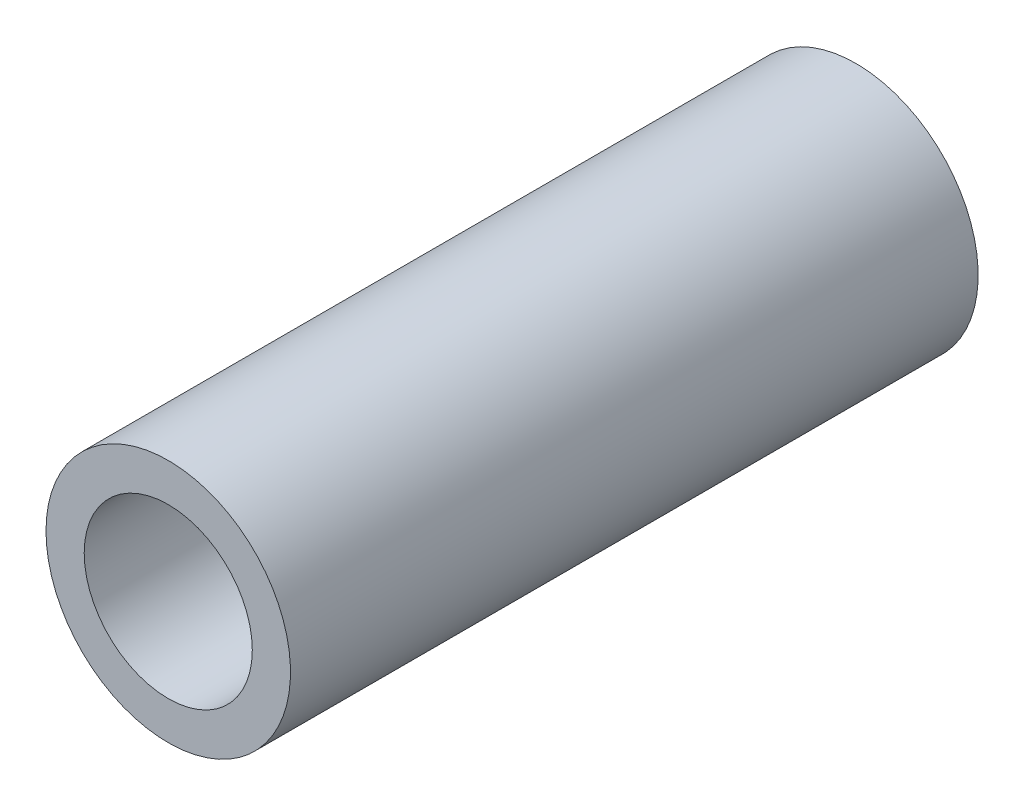
ISO-10303-21;
HEADER;
FILE_DESCRIPTION(('STEP AP214'),'2;1');
FILE_NAME('part.step','',(''),(''),'','','');
FILE_SCHEMA(('AUTOMOTIVE_DESIGN { 1 0 10303 214 1 1 1 1 }'));
ENDSEC;
DATA;
#1=APPLICATION_CONTEXT('core data for automotive mechanical design processes');
#2=APPLICATION_PROTOCOL_DEFINITION('international standard','automotive_design',2000,#1);
#3=PRODUCT_CONTEXT('',#1,'mechanical');
#4=PRODUCT('Part','Part','',(#3));
#5=PRODUCT_RELATED_PRODUCT_CATEGORY('part','',(#4));
#6=PRODUCT_DEFINITION_FORMATION('','',#4);
#7=PRODUCT_DEFINITION_CONTEXT('part definition',#1,'design');
#8=PRODUCT_DEFINITION('design','',#6,#7);
#9=PRODUCT_DEFINITION_SHAPE('','',#8);
#10=(LENGTH_UNIT() NAMED_UNIT(*) SI_UNIT(.MILLI.,.METRE.));
#11=(NAMED_UNIT(*) PLANE_ANGLE_UNIT() SI_UNIT($,.RADIAN.));
#12=(NAMED_UNIT(*) SI_UNIT($,.STERADIAN.) SOLID_ANGLE_UNIT());
#13=UNCERTAINTY_MEASURE_WITH_UNIT(LENGTH_MEASURE(1.E-05),#10,'distance_accuracy_value','');
#14=(GEOMETRIC_REPRESENTATION_CONTEXT(3) GLOBAL_UNCERTAINTY_ASSIGNED_CONTEXT((#13)) GLOBAL_UNIT_ASSIGNED_CONTEXT((#10,
#11,#12)) REPRESENTATION_CONTEXT('',''));
#15=CARTESIAN_POINT('',(0.,0.,0.));
#16=DIRECTION('',(0.,0.,1.));
#17=DIRECTION('',(1.,0.,0.));
#18=AXIS2_PLACEMENT_3D('',#15,#16,#17);
#19=CARTESIAN_POINT('',(0.,0.,11.25));
#20=DIRECTION('',(0.,0.,1.));
#21=DIRECTION('',(1.,0.,0.));
#22=AXIS2_PLACEMENT_3D('',#19,#20,#21);
#23=PLANE('',#22);
#24=CARTESIAN_POINT('',(0.,0.,11.25));
#25=DIRECTION('',(0.,0.,1.));
#26=DIRECTION('',(1.,0.,0.));
#27=AXIS2_PLACEMENT_3D('',#24,#25,#26);
#28=CIRCLE('',#27,2.);
#29=CARTESIAN_POINT('',(-2.,0.,11.25));
#30=VERTEX_POINT('',#29);
#31=EDGE_CURVE('E10',#30,#30,#28,.T.);
#32=ORIENTED_EDGE('',*,*,#31,.T.);
#33=EDGE_LOOP('',(#32));
#34=FACE_BOUND('',#33,.T.);
#35=CARTESIAN_POINT('',(0.,0.,11.25));
#36=DIRECTION('',(0.,0.,1.));
#37=DIRECTION('',(1.,0.,0.));
#38=AXIS2_PLACEMENT_3D('',#35,#36,#37);
#39=CIRCLE('',#38,1.375);
#40=CARTESIAN_POINT('',(-1.375,0.,11.25));
#41=VERTEX_POINT('',#40);
#42=EDGE_CURVE('E42',#41,#41,#39,.T.);
#43=ORIENTED_EDGE('',*,*,#42,.F.);
#44=EDGE_LOOP('',(#43));
#45=FACE_BOUND('',#44,.T.);
#46=ADVANCED_FACE('F31',(#34,#45),#23,.T.);
#47=CARTESIAN_POINT('',(0.,0.,0.));
#48=DIRECTION('',(0.,0.,1.));
#49=DIRECTION('',(1.,0.,0.));
#50=AXIS2_PLACEMENT_3D('',#47,#48,#49);
#51=PLANE('',#50);
#52=CARTESIAN_POINT('',(0.,0.,0.));
#53=DIRECTION('',(0.,0.,1.));
#54=DIRECTION('',(1.,0.,0.));
#55=AXIS2_PLACEMENT_3D('',#52,#53,#54);
#56=CIRCLE('',#55,2.);
#57=CARTESIAN_POINT('',(-2.,0.,0.));
#58=VERTEX_POINT('',#57);
#59=EDGE_CURVE('E35',#58,#58,#56,.T.);
#60=ORIENTED_EDGE('',*,*,#59,.F.);
#61=EDGE_LOOP('',(#60));
#62=FACE_BOUND('',#61,.T.);
#63=CARTESIAN_POINT('',(0.,0.,0.));
#64=DIRECTION('',(0.,0.,1.));
#65=DIRECTION('',(1.,0.,0.));
#66=AXIS2_PLACEMENT_3D('',#63,#64,#65);
#67=CIRCLE('',#66,1.375);
#68=CARTESIAN_POINT('',(-1.375,0.,0.));
#69=VERTEX_POINT('',#68);
#70=EDGE_CURVE('E44',#69,#69,#67,.T.);
#71=ORIENTED_EDGE('',*,*,#70,.T.);
#72=EDGE_LOOP('',(#71));
#73=FACE_BOUND('',#72,.T.);
#74=ADVANCED_FACE('F54',(#62,#73),#51,.F.);
#75=CARTESIAN_POINT('',(0.,0.,11.25));
#76=DIRECTION('',(0.,0.,-1.));
#77=DIRECTION('',(-1.,0.,0.));
#78=AXIS2_PLACEMENT_3D('',#75,#76,#77);
#79=CYLINDRICAL_SURFACE('',#78,2.);
#80=CARTESIAN_POINT('',(-2.,0.,11.25));
#81=CARTESIAN_POINT('',(-2.,0.,11.1328125));
#82=CARTESIAN_POINT('',(-2.,0.,11.015625));
#83=CARTESIAN_POINT('',(-2.,0.,10.78125));
#84=CARTESIAN_POINT('',(-2.,0.,10.6640625));
#85=CARTESIAN_POINT('',(-2.,0.,10.4296875));
#86=CARTESIAN_POINT('',(-2.,0.,10.3125));
#87=CARTESIAN_POINT('',(-2.,0.,10.078125));
#88=CARTESIAN_POINT('',(-2.,0.,9.9609375));
#89=CARTESIAN_POINT('',(-2.,0.,9.7265625));
#90=CARTESIAN_POINT('',(-2.,0.,9.609375));
#91=CARTESIAN_POINT('',(-2.,0.,9.375));
#92=CARTESIAN_POINT('',(-2.,0.,9.2578125));
#93=CARTESIAN_POINT('',(-2.,0.,9.0234375));
#94=CARTESIAN_POINT('',(-2.,0.,8.90625));
#95=CARTESIAN_POINT('',(-2.,0.,8.671875));
#96=CARTESIAN_POINT('',(-2.,0.,8.5546875));
#97=CARTESIAN_POINT('',(-2.,0.,8.3203125));
#98=CARTESIAN_POINT('',(-2.,0.,8.203125));
#99=CARTESIAN_POINT('',(-2.,0.,7.96875));
#100=CARTESIAN_POINT('',(-2.,0.,7.8515625));
#101=CARTESIAN_POINT('',(-2.,0.,7.6171875));
#102=CARTESIAN_POINT('',(-2.,0.,7.5));
#103=CARTESIAN_POINT('',(-2.,0.,7.265625));
#104=CARTESIAN_POINT('',(-2.,0.,7.1484375));
#105=CARTESIAN_POINT('',(-2.,0.,6.9140625));
#106=CARTESIAN_POINT('',(-2.,0.,6.796875));
#107=CARTESIAN_POINT('',(-2.,0.,6.5625));
#108=CARTESIAN_POINT('',(-2.,0.,6.4453125));
#109=CARTESIAN_POINT('',(-2.,0.,6.2109375));
#110=CARTESIAN_POINT('',(-2.,0.,6.09375));
#111=CARTESIAN_POINT('',(-2.,0.,5.859375));
#112=CARTESIAN_POINT('',(-2.,0.,5.7421875));
#113=CARTESIAN_POINT('',(-2.,0.,5.5078125));
#114=CARTESIAN_POINT('',(-2.,0.,5.390625));
#115=CARTESIAN_POINT('',(-2.,0.,5.15625));
#116=CARTESIAN_POINT('',(-2.,0.,5.0390625));
#117=CARTESIAN_POINT('',(-2.,0.,4.8046875));
#118=CARTESIAN_POINT('',(-2.,0.,4.6875));
#119=CARTESIAN_POINT('',(-2.,0.,4.453125));
#120=CARTESIAN_POINT('',(-2.,0.,4.3359375));
#121=CARTESIAN_POINT('',(-2.,0.,4.1015625));
#122=CARTESIAN_POINT('',(-2.,0.,3.984375));
#123=CARTESIAN_POINT('',(-2.,0.,3.75));
#124=CARTESIAN_POINT('',(-2.,0.,3.6328125));
#125=CARTESIAN_POINT('',(-2.,0.,3.3984375));
#126=CARTESIAN_POINT('',(-2.,0.,3.28125));
#127=CARTESIAN_POINT('',(-2.,0.,3.046875));
#128=CARTESIAN_POINT('',(-2.,0.,2.9296875));
#129=CARTESIAN_POINT('',(-2.,0.,2.6953125));
#130=CARTESIAN_POINT('',(-2.,0.,2.578125));
#131=CARTESIAN_POINT('',(-2.,0.,2.34375));
#132=CARTESIAN_POINT('',(-2.,0.,2.2265625));
#133=CARTESIAN_POINT('',(-2.,0.,1.9921875));
#134=CARTESIAN_POINT('',(-2.,0.,1.875));
#135=CARTESIAN_POINT('',(-2.,0.,1.640625));
#136=CARTESIAN_POINT('',(-2.,0.,1.5234375));
#137=CARTESIAN_POINT('',(-2.,0.,1.2890625));
#138=CARTESIAN_POINT('',(-2.,0.,1.171875));
#139=CARTESIAN_POINT('',(-2.,0.,0.937499999999999));
#140=CARTESIAN_POINT('',(-2.,0.,0.820312499999999));
#141=CARTESIAN_POINT('',(-2.,0.,0.585937499999998));
#142=CARTESIAN_POINT('',(-2.,0.,0.468749999999998));
#143=CARTESIAN_POINT('',(-2.,0.,0.234374999999998));
#144=CARTESIAN_POINT('',(-2.,0.,0.117187499999998));
#145=CARTESIAN_POINT('',(-2.,0.,0.));
#146=B_SPLINE_CURVE_WITH_KNOTS('',3,(#80,#81,#82,#83,#84,#85,#86,#87,#88,#89,#90,#91,#92,#93,
#94,#95,#96,#97,#98,#99,#100,#101,#102,#103,#104,#105,#106,#107,#108,#109,#110,#111,#112,#113,
#114,#115,#116,#117,#118,#119,#120,#121,#122,#123,#124,#125,#126,#127,#128,#129,#130,#131,#132,
#133,#134,#135,#136,#137,#138,#139,#140,#141,#142,#143,#144,#145),.UNSPECIFIED.,.F.,.F.,(4,2,2,
2,2,2,2,2,2,2,2,2,2,2,2,2,2,2,2,2,2,2,2,2,2,2,2,2,2,2,2,2,4),(0.,0.351562500000001,
0.703125000000001,1.0546875,1.40625,1.7578125,2.109375,2.4609375,2.8125,3.1640625,3.515625,
3.8671875,4.21875,4.5703125,4.921875,5.2734375,5.625,5.9765625,6.328125,6.6796875,7.03125,
7.3828125,7.734375,8.0859375,8.4375,8.7890625,9.140625,9.4921875,9.84375,10.1953125,10.546875,
10.8984375,11.25),.UNSPECIFIED.);
#147=EDGE_CURVE('BSEAM33',#30,#58,#146,.T.);
#148=ORIENTED_EDGE('',*,*,#31,.F.);
#149=ORIENTED_EDGE('',*,*,#59,.T.);
#150=ORIENTED_EDGE('',*,*,#147,.T.);
#151=ORIENTED_EDGE('',*,*,#147,.F.);
#152=EDGE_LOOP('',(#148,#150,#149,#151));
#153=FACE_BOUND('',#152,.T.);
#154=ADVANCED_FACE('F33',(#153),#79,.T.);
#155=CARTESIAN_POINT('',(0.,0.,11.25));
#156=DIRECTION('',(0.,0.,-1.));
#157=DIRECTION('',(-1.,0.,0.));
#158=AXIS2_PLACEMENT_3D('',#155,#156,#157);
#159=CYLINDRICAL_SURFACE('',#158,1.375);
#160=CARTESIAN_POINT('',(-1.375,0.,11.25));
#161=CARTESIAN_POINT('',(-1.375,0.,11.1328125));
#162=CARTESIAN_POINT('',(-1.375,0.,11.015625));
#163=CARTESIAN_POINT('',(-1.375,0.,10.78125));
#164=CARTESIAN_POINT('',(-1.375,0.,10.6640625));
#165=CARTESIAN_POINT('',(-1.375,0.,10.4296875));
#166=CARTESIAN_POINT('',(-1.375,0.,10.3125));
#167=CARTESIAN_POINT('',(-1.375,0.,10.078125));
#168=CARTESIAN_POINT('',(-1.375,0.,9.9609375));
#169=CARTESIAN_POINT('',(-1.375,0.,9.7265625));
#170=CARTESIAN_POINT('',(-1.375,0.,9.609375));
#171=CARTESIAN_POINT('',(-1.375,0.,9.375));
#172=CARTESIAN_POINT('',(-1.375,0.,9.2578125));
#173=CARTESIAN_POINT('',(-1.375,0.,9.0234375));
#174=CARTESIAN_POINT('',(-1.375,0.,8.90625));
#175=CARTESIAN_POINT('',(-1.375,0.,8.671875));
#176=CARTESIAN_POINT('',(-1.375,0.,8.5546875));
#177=CARTESIAN_POINT('',(-1.375,0.,8.3203125));
#178=CARTESIAN_POINT('',(-1.375,0.,8.203125));
#179=CARTESIAN_POINT('',(-1.375,0.,7.96875));
#180=CARTESIAN_POINT('',(-1.375,0.,7.8515625));
#181=CARTESIAN_POINT('',(-1.375,0.,7.6171875));
#182=CARTESIAN_POINT('',(-1.375,0.,7.5));
#183=CARTESIAN_POINT('',(-1.375,0.,7.265625));
#184=CARTESIAN_POINT('',(-1.375,0.,7.1484375));
#185=CARTESIAN_POINT('',(-1.375,0.,6.9140625));
#186=CARTESIAN_POINT('',(-1.375,0.,6.796875));
#187=CARTESIAN_POINT('',(-1.375,0.,6.5625));
#188=CARTESIAN_POINT('',(-1.375,0.,6.4453125));
#189=CARTESIAN_POINT('',(-1.375,0.,6.2109375));
#190=CARTESIAN_POINT('',(-1.375,0.,6.09375));
#191=CARTESIAN_POINT('',(-1.375,0.,5.859375));
#192=CARTESIAN_POINT('',(-1.375,0.,5.7421875));
#193=CARTESIAN_POINT('',(-1.375,0.,5.5078125));
#194=CARTESIAN_POINT('',(-1.375,0.,5.390625));
#195=CARTESIAN_POINT('',(-1.375,0.,5.15625));
#196=CARTESIAN_POINT('',(-1.375,0.,5.0390625));
#197=CARTESIAN_POINT('',(-1.375,0.,4.8046875));
#198=CARTESIAN_POINT('',(-1.375,0.,4.6875));
#199=CARTESIAN_POINT('',(-1.375,0.,4.453125));
#200=CARTESIAN_POINT('',(-1.375,0.,4.3359375));
#201=CARTESIAN_POINT('',(-1.375,0.,4.1015625));
#202=CARTESIAN_POINT('',(-1.375,0.,3.984375));
#203=CARTESIAN_POINT('',(-1.375,0.,3.75));
#204=CARTESIAN_POINT('',(-1.375,0.,3.6328125));
#205=CARTESIAN_POINT('',(-1.375,0.,3.3984375));
#206=CARTESIAN_POINT('',(-1.375,0.,3.28125));
#207=CARTESIAN_POINT('',(-1.375,0.,3.046875));
#208=CARTESIAN_POINT('',(-1.375,0.,2.9296875));
#209=CARTESIAN_POINT('',(-1.375,0.,2.6953125));
#210=CARTESIAN_POINT('',(-1.375,0.,2.578125));
#211=CARTESIAN_POINT('',(-1.375,0.,2.34375));
#212=CARTESIAN_POINT('',(-1.375,0.,2.2265625));
#213=CARTESIAN_POINT('',(-1.375,0.,1.9921875));
#214=CARTESIAN_POINT('',(-1.375,0.,1.875));
#215=CARTESIAN_POINT('',(-1.375,0.,1.640625));
#216=CARTESIAN_POINT('',(-1.375,0.,1.5234375));
#217=CARTESIAN_POINT('',(-1.375,0.,1.2890625));
#218=CARTESIAN_POINT('',(-1.375,0.,1.171875));
#219=CARTESIAN_POINT('',(-1.375,0.,0.937499999999999));
#220=CARTESIAN_POINT('',(-1.375,0.,0.820312499999999));
#221=CARTESIAN_POINT('',(-1.375,0.,0.585937499999998));
#222=CARTESIAN_POINT('',(-1.375,0.,0.468749999999998));
#223=CARTESIAN_POINT('',(-1.375,0.,0.234374999999998));
#224=CARTESIAN_POINT('',(-1.375,0.,0.117187499999998));
#225=CARTESIAN_POINT('',(-1.375,0.,0.));
#226=B_SPLINE_CURVE_WITH_KNOTS('',3,(#160,#161,#162,#163,#164,#165,#166,#167,#168,#169,#170,
#171,#172,#173,#174,#175,#176,#177,#178,#179,#180,#181,#182,#183,#184,#185,#186,#187,#188,#189,
#190,#191,#192,#193,#194,#195,#196,#197,#198,#199,#200,#201,#202,#203,#204,#205,#206,#207,#208,
#209,#210,#211,#212,#213,#214,#215,#216,#217,#218,#219,#220,#221,#222,#223,#224,#225),
.UNSPECIFIED.,.F.,.F.,(4,2,2,2,2,2,2,2,2,2,2,2,2,2,2,2,2,2,2,2,2,2,2,2,2,2,2,2,2,2,2,2,4),(0.,
0.351562500000001,0.703125000000001,1.0546875,1.40625,1.7578125,2.109375,2.4609375,2.8125,
3.1640625,3.515625,3.8671875,4.21875,4.5703125,4.921875,5.2734375,5.625,5.9765625,6.328125,
6.6796875,7.03125,7.3828125,7.734375,8.0859375,8.4375,8.7890625,9.140625,9.4921875,9.84375,
10.1953125,10.546875,10.8984375,11.25),.UNSPECIFIED.);
#227=EDGE_CURVE('BSEAM50',#41,#69,#226,.T.);
#228=ORIENTED_EDGE('',*,*,#42,.T.);
#229=ORIENTED_EDGE('',*,*,#70,.F.);
#230=ORIENTED_EDGE('',*,*,#227,.T.);
#231=ORIENTED_EDGE('',*,*,#227,.F.);
#232=EDGE_LOOP('',(#228,#230,#229,#231));
#233=FACE_BOUND('',#232,.T.);
#234=ADVANCED_FACE('F50',(#233),#159,.F.);
#235=CLOSED_SHELL('',(#46,#74,#154,#234));
#236=MANIFOLD_SOLID_BREP('B2',#235);
#237=ADVANCED_BREP_SHAPE_REPRESENTATION('',(#18,#236),#14);
#238=SHAPE_DEFINITION_REPRESENTATION(#9,#237);
ENDSEC;
END-ISO-10303-21;
